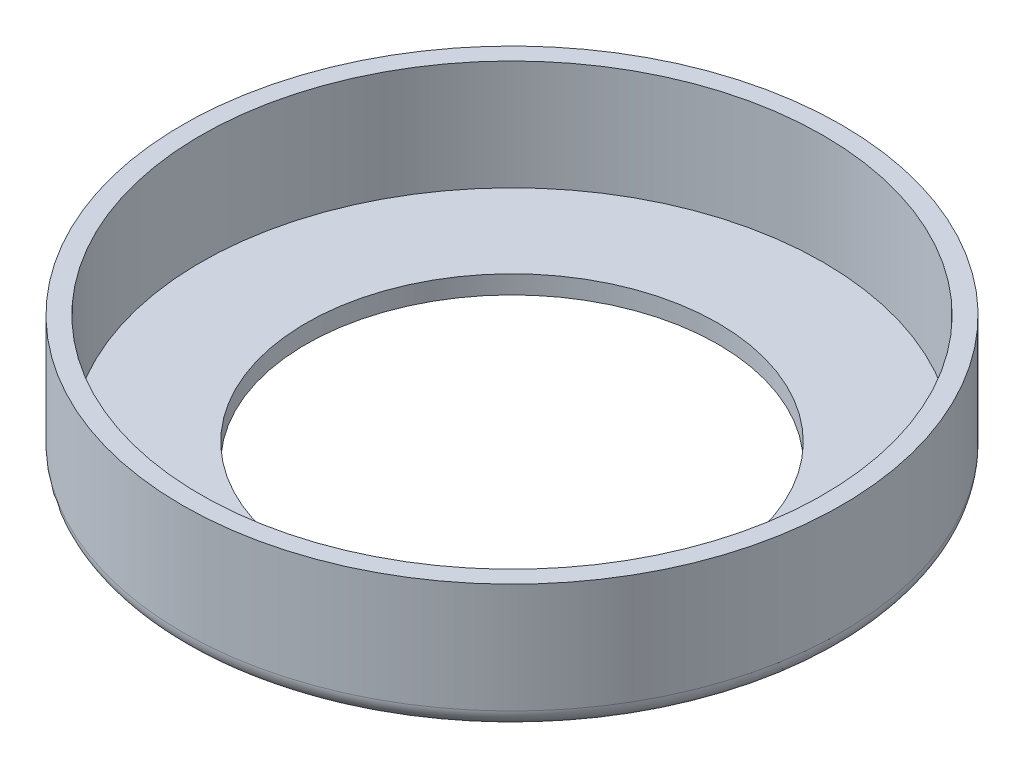
ISO-10303-21;
HEADER;
FILE_DESCRIPTION(('STEP AP214'),'2;1');
FILE_NAME('part.step','',(''),(''),'','','');
FILE_SCHEMA(('AUTOMOTIVE_DESIGN { 1 0 10303 214 1 1 1 1 }'));
ENDSEC;
DATA;
#1=APPLICATION_CONTEXT('core data for automotive mechanical design processes');
#2=APPLICATION_PROTOCOL_DEFINITION('international standard','automotive_design',2000,#1);
#3=PRODUCT_CONTEXT('',#1,'mechanical');
#4=PRODUCT('Part','Part','',(#3));
#5=PRODUCT_RELATED_PRODUCT_CATEGORY('part','',(#4));
#6=PRODUCT_DEFINITION_FORMATION('','',#4);
#7=PRODUCT_DEFINITION_CONTEXT('part definition',#1,'design');
#8=PRODUCT_DEFINITION('design','',#6,#7);
#9=PRODUCT_DEFINITION_SHAPE('','',#8);
#10=(LENGTH_UNIT() NAMED_UNIT(*) SI_UNIT(.MILLI.,.METRE.));
#11=(NAMED_UNIT(*) PLANE_ANGLE_UNIT() SI_UNIT($,.RADIAN.));
#12=(NAMED_UNIT(*) SI_UNIT($,.STERADIAN.) SOLID_ANGLE_UNIT());
#13=UNCERTAINTY_MEASURE_WITH_UNIT(LENGTH_MEASURE(1.E-05),#10,'distance_accuracy_value','');
#14=(GEOMETRIC_REPRESENTATION_CONTEXT(3) GLOBAL_UNCERTAINTY_ASSIGNED_CONTEXT((#13)) GLOBAL_UNIT_ASSIGNED_CONTEXT((#10,
#11,#12)) REPRESENTATION_CONTEXT('',''));
#15=CARTESIAN_POINT('',(0.,0.,0.));
#16=DIRECTION('',(0.,0.,1.));
#17=DIRECTION('',(1.,0.,0.));
#18=AXIS2_PLACEMENT_3D('',#15,#16,#17);
#19=CARTESIAN_POINT('',(0.,14.,0.));
#20=DIRECTION('',(0.,-1.,0.));
#21=DIRECTION('',(0.,0.,-1.));
#22=AXIS2_PLACEMENT_3D('',#19,#20,#21);
#23=PLANE('',#22);
#24=CARTESIAN_POINT('',(0.,14.,0.));
#25=DIRECTION('',(0.,-1.,0.));
#26=DIRECTION('',(0.,0.,-1.));
#27=AXIS2_PLACEMENT_3D('',#24,#25,#26);
#28=CIRCLE('',#27,34.);
#29=CARTESIAN_POINT('',(0.,14.,-34.));
#30=VERTEX_POINT('',#29);
#31=EDGE_CURVE('E59',#30,#30,#28,.F.);
#32=ORIENTED_EDGE('',*,*,#31,.F.);
#33=EDGE_LOOP('',(#32));
#34=FACE_BOUND('',#33,.T.);
#35=CARTESIAN_POINT('',(0.,14.,0.));
#36=DIRECTION('',(0.,-1.,0.));
#37=DIRECTION('',(0.,0.,-1.));
#38=AXIS2_PLACEMENT_3D('',#35,#36,#37);
#39=CIRCLE('',#38,36.);
#40=CARTESIAN_POINT('',(0.,14.,-36.));
#41=VERTEX_POINT('',#40);
#42=EDGE_CURVE('E11',#41,#41,#39,.F.);
#43=ORIENTED_EDGE('',*,*,#42,.T.);
#44=EDGE_LOOP('',(#43));
#45=FACE_BOUND('',#44,.T.);
#46=ADVANCED_FACE('F53',(#34,#45),#23,.F.);
#47=CARTESIAN_POINT('',(22.5,0.,0.));
#48=DIRECTION('',(0.,-1.,0.));
#49=DIRECTION('',(0.,0.,-1.));
#50=AXIS2_PLACEMENT_3D('',#47,#48,#49);
#51=PLANE('',#50);
#52=CARTESIAN_POINT('',(0.,0.,0.));
#53=DIRECTION('',(0.,-1.,0.));
#54=DIRECTION('',(0.,0.,-1.));
#55=AXIS2_PLACEMENT_3D('',#52,#53,#54);
#56=CIRCLE('',#55,34.);
#57=CARTESIAN_POINT('',(0.,0.,-34.));
#58=VERTEX_POINT('',#57);
#59=EDGE_CURVE('E67',#58,#58,#56,.T.);
#60=ORIENTED_EDGE('',*,*,#59,.T.);
#61=EDGE_LOOP('',(#60));
#62=FACE_BOUND('',#61,.T.);
#63=CARTESIAN_POINT('',(0.,0.,0.));
#64=DIRECTION('',(0.,-1.,0.));
#65=DIRECTION('',(0.,0.,-1.));
#66=AXIS2_PLACEMENT_3D('',#63,#64,#65);
#67=CIRCLE('',#66,22.5);
#68=CARTESIAN_POINT('',(0.,0.,-22.5));
#69=VERTEX_POINT('',#68);
#70=EDGE_CURVE('E63',#69,#69,#67,.T.);
#71=ORIENTED_EDGE('',*,*,#70,.F.);
#72=EDGE_LOOP('',(#71));
#73=FACE_BOUND('',#72,.T.);
#74=ADVANCED_FACE('F90',(#62,#73),#51,.T.);
#75=CARTESIAN_POINT('',(0.,2.,0.));
#76=DIRECTION('',(0.,-1.,0.));
#77=DIRECTION('',(0.,0.,-1.));
#78=AXIS2_PLACEMENT_3D('',#75,#76,#77);
#79=TOROIDAL_SURFACE('',#78,34.,2.);
#80=CARTESIAN_POINT('',(0.,2.,0.));
#81=DIRECTION('',(0.,-1.,0.));
#82=DIRECTION('',(0.,0.,-1.));
#83=AXIS2_PLACEMENT_3D('',#80,#81,#82);
#84=CIRCLE('',#83,36.);
#85=CARTESIAN_POINT('',(0.,2.,-36.));
#86=VERTEX_POINT('',#85);
#87=EDGE_CURVE('E72',#86,#86,#84,.T.);
#88=ORIENTED_EDGE('',*,*,#87,.T.);
#89=EDGE_LOOP('',(#88));
#90=FACE_BOUND('',#89,.T.);
#91=ORIENTED_EDGE('',*,*,#59,.F.);
#92=EDGE_LOOP('',(#91));
#93=FACE_BOUND('',#92,.T.);
#94=ADVANCED_FACE('F92',(#90,#93),#79,.T.);
#95=CARTESIAN_POINT('',(0.,2.,0.));
#96=DIRECTION('',(0.,-1.,0.));
#97=DIRECTION('',(0.,0.,-1.));
#98=AXIS2_PLACEMENT_3D('',#95,#96,#97);
#99=CYLINDRICAL_SURFACE('',#98,36.);
#100=ORIENTED_EDGE('',*,*,#42,.F.);
#101=EDGE_LOOP('',(#100));
#102=FACE_BOUND('',#101,.T.);
#103=ORIENTED_EDGE('',*,*,#87,.F.);
#104=EDGE_LOOP('',(#103));
#105=FACE_BOUND('',#104,.T.);
#106=ADVANCED_FACE('F87',(#102,#105),#99,.T.);
#107=CARTESIAN_POINT('',(0.,2.,0.));
#108=DIRECTION('',(0.,-1.,0.));
#109=DIRECTION('',(0.,0.,-1.));
#110=AXIS2_PLACEMENT_3D('',#107,#108,#109);
#111=CYLINDRICAL_SURFACE('',#110,22.5);
#112=CARTESIAN_POINT('',(0.,2.,0.));
#113=DIRECTION('',(0.,-1.,0.));
#114=DIRECTION('',(0.,0.,-1.));
#115=AXIS2_PLACEMENT_3D('',#112,#113,#114);
#116=CIRCLE('',#115,22.5);
#117=CARTESIAN_POINT('',(0.,2.,-22.5));
#118=VERTEX_POINT('',#117);
#119=EDGE_CURVE('E78',#118,#118,#116,.T.);
#120=ORIENTED_EDGE('',*,*,#119,.F.);
#121=EDGE_LOOP('',(#120));
#122=FACE_BOUND('',#121,.T.);
#123=ORIENTED_EDGE('',*,*,#70,.T.);
#124=EDGE_LOOP('',(#123));
#125=FACE_BOUND('',#124,.T.);
#126=ADVANCED_FACE('F84',(#122,#125),#111,.F.);
#127=CARTESIAN_POINT('',(0.,2.,0.));
#128=DIRECTION('',(0.,-1.,0.));
#129=DIRECTION('',(0.,0.,-1.));
#130=AXIS2_PLACEMENT_3D('',#127,#128,#129);
#131=PLANE('',#130);
#132=CARTESIAN_POINT('',(0.,2.,0.));
#133=DIRECTION('',(0.,-1.,0.));
#134=DIRECTION('',(0.,0.,-1.));
#135=AXIS2_PLACEMENT_3D('',#132,#133,#134);
#136=CIRCLE('',#135,34.);
#137=CARTESIAN_POINT('',(0.,2.,-34.));
#138=VERTEX_POINT('',#137);
#139=EDGE_CURVE('E75',#138,#138,#136,.T.);
#140=ORIENTED_EDGE('',*,*,#139,.F.);
#141=EDGE_LOOP('',(#140));
#142=FACE_BOUND('',#141,.T.);
#143=ORIENTED_EDGE('',*,*,#119,.T.);
#144=EDGE_LOOP('',(#143));
#145=FACE_BOUND('',#144,.T.);
#146=ADVANCED_FACE('F82',(#142,#145),#131,.F.);
#147=CARTESIAN_POINT('',(0.,20.,0.));
#148=DIRECTION('',(0.,-1.,0.));
#149=DIRECTION('',(0.,0.,-1.));
#150=AXIS2_PLACEMENT_3D('',#147,#148,#149);
#151=CYLINDRICAL_SURFACE('',#150,34.);
#152=ORIENTED_EDGE('',*,*,#31,.T.);
#153=EDGE_LOOP('',(#152));
#154=FACE_BOUND('',#153,.T.);
#155=ORIENTED_EDGE('',*,*,#139,.T.);
#156=EDGE_LOOP('',(#155));
#157=FACE_BOUND('',#156,.T.);
#158=ADVANCED_FACE('F106',(#154,#157),#151,.F.);
#159=CLOSED_SHELL('',(#46,#74,#94,#106,#126,#146,#158));
#160=MANIFOLD_SOLID_BREP('B2',#159);
#161=ADVANCED_BREP_SHAPE_REPRESENTATION('',(#18,#160),#14);
#162=SHAPE_DEFINITION_REPRESENTATION(#9,#161);
ENDSEC;
END-ISO-10303-21;
